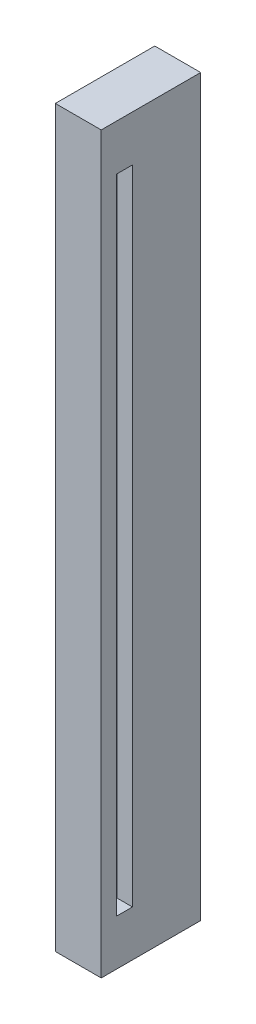
ISO-10303-21;
HEADER;
FILE_DESCRIPTION(('STEP AP214'),'2;1');
FILE_NAME('part.step','',(''),(''),'','','');
FILE_SCHEMA(('AUTOMOTIVE_DESIGN { 1 0 10303 214 1 1 1 1 }'));
ENDSEC;
DATA;
#1=APPLICATION_CONTEXT('core data for automotive mechanical design processes');
#2=APPLICATION_PROTOCOL_DEFINITION('international standard','automotive_design',2000,#1);
#3=PRODUCT_CONTEXT('',#1,'mechanical');
#4=PRODUCT('Part','Part','',(#3));
#5=PRODUCT_RELATED_PRODUCT_CATEGORY('part','',(#4));
#6=PRODUCT_DEFINITION_FORMATION('','',#4);
#7=PRODUCT_DEFINITION_CONTEXT('part definition',#1,'design');
#8=PRODUCT_DEFINITION('design','',#6,#7);
#9=PRODUCT_DEFINITION_SHAPE('','',#8);
#10=(LENGTH_UNIT() NAMED_UNIT(*) SI_UNIT(.MILLI.,.METRE.));
#11=(NAMED_UNIT(*) PLANE_ANGLE_UNIT() SI_UNIT($,.RADIAN.));
#12=(NAMED_UNIT(*) SI_UNIT($,.STERADIAN.) SOLID_ANGLE_UNIT());
#13=UNCERTAINTY_MEASURE_WITH_UNIT(LENGTH_MEASURE(1.E-05),#10,'distance_accuracy_value','');
#14=(GEOMETRIC_REPRESENTATION_CONTEXT(3) GLOBAL_UNCERTAINTY_ASSIGNED_CONTEXT((#13)) GLOBAL_UNIT_ASSIGNED_CONTEXT((#10,
#11,#12)) REPRESENTATION_CONTEXT('',''));
#15=CARTESIAN_POINT('',(0.,0.,0.));
#16=DIRECTION('',(0.,0.,1.));
#17=DIRECTION('',(1.,0.,0.));
#18=AXIS2_PLACEMENT_3D('',#15,#16,#17);
#19=CARTESIAN_POINT('',(9.525,-152.4,41.275));
#20=DIRECTION('',(-1.,0.,0.));
#21=DIRECTION('',(0.,0.,1.));
#22=AXIS2_PLACEMENT_3D('',#19,#20,#21);
#23=PLANE('',#22);
#24=DIRECTION('',(0.,0.,-1.));
#25=VECTOR('',#24,1.);
#26=CARTESIAN_POINT('',(9.525,-133.35,34.925));
#27=LINE('',#26,#25);
#28=CARTESIAN_POINT('',(9.525,-133.35,34.925));
#29=VERTEX_POINT('',#28);
#30=CARTESIAN_POINT('',(9.525,-133.35,28.321));
#31=VERTEX_POINT('',#30);
#32=EDGE_CURVE('E134',#29,#31,#27,.T.);
#33=ORIENTED_EDGE('',*,*,#32,.F.);
#34=DIRECTION('',(0.,-1.,0.));
#35=VECTOR('',#34,1.);
#36=CARTESIAN_POINT('',(9.525,133.35,34.925));
#37=LINE('',#36,#35);
#38=CARTESIAN_POINT('',(9.525,133.35,34.925));
#39=VERTEX_POINT('',#38);
#40=EDGE_CURVE('E46',#39,#29,#37,.T.);
#41=ORIENTED_EDGE('',*,*,#40,.F.);
#42=DIRECTION('',(0.,0.,1.));
#43=VECTOR('',#42,1.);
#44=CARTESIAN_POINT('',(9.525,133.35,34.925));
#45=LINE('',#44,#43);
#46=CARTESIAN_POINT('',(9.525,133.35,28.321));
#47=VERTEX_POINT('',#46);
#48=EDGE_CURVE('E125',#47,#39,#45,.T.);
#49=ORIENTED_EDGE('',*,*,#48,.F.);
#50=DIRECTION('',(0.,1.,0.));
#51=VECTOR('',#50,1.);
#52=CARTESIAN_POINT('',(9.525,133.35,28.321));
#53=LINE('',#52,#51);
#54=EDGE_CURVE('E128',#31,#47,#53,.T.);
#55=ORIENTED_EDGE('',*,*,#54,.F.);
#56=EDGE_LOOP('',(#33,#41,#49,#55));
#57=FACE_BOUND('',#56,.T.);
#58=DIRECTION('',(0.,1.,0.));
#59=VECTOR('',#58,1.);
#60=CARTESIAN_POINT('',(9.525,-152.4,0.));
#61=LINE('',#60,#59);
#62=CARTESIAN_POINT('',(9.525,-152.4,0.));
#63=VERTEX_POINT('',#62);
#64=CARTESIAN_POINT('',(9.525,152.4,0.));
#65=VERTEX_POINT('',#64);
#66=EDGE_CURVE('E140',#63,#65,#61,.T.);
#67=ORIENTED_EDGE('',*,*,#66,.T.);
#68=DIRECTION('',(0.,0.,-1.));
#69=VECTOR('',#68,1.);
#70=CARTESIAN_POINT('',(9.525,152.4,41.275));
#71=LINE('',#70,#69);
#72=CARTESIAN_POINT('',(9.525,152.4,41.275));
#73=VERTEX_POINT('',#72);
#74=EDGE_CURVE('E11',#73,#65,#71,.T.);
#75=ORIENTED_EDGE('',*,*,#74,.F.);
#76=DIRECTION('',(0.,1.,0.));
#77=VECTOR('',#76,1.);
#78=CARTESIAN_POINT('',(9.525,-152.4,41.275));
#79=LINE('',#78,#77);
#80=CARTESIAN_POINT('',(9.525,-152.4,41.275));
#81=VERTEX_POINT('',#80);
#82=EDGE_CURVE('E144',#81,#73,#79,.T.);
#83=ORIENTED_EDGE('',*,*,#82,.F.);
#84=DIRECTION('',(0.,0.,-1.));
#85=VECTOR('',#84,1.);
#86=CARTESIAN_POINT('',(9.525,-152.4,41.275));
#87=LINE('',#86,#85);
#88=EDGE_CURVE('E150',#81,#63,#87,.T.);
#89=ORIENTED_EDGE('',*,*,#88,.T.);
#90=EDGE_LOOP('',(#67,#75,#83,#89));
#91=FACE_BOUND('',#90,.T.);
#92=ADVANCED_FACE('F32',(#57,#91),#23,.F.);
#93=CARTESIAN_POINT('',(-9.525,152.4,41.275));
#94=DIRECTION('',(0.,-1.,0.));
#95=DIRECTION('',(0.,0.,-1.));
#96=AXIS2_PLACEMENT_3D('',#93,#94,#95);
#97=PLANE('',#96);
#98=DIRECTION('',(-1.,0.,0.));
#99=VECTOR('',#98,1.);
#100=CARTESIAN_POINT('',(-9.525,152.4,0.));
#101=LINE('',#100,#99);
#102=CARTESIAN_POINT('',(-9.525,152.4,0.));
#103=VERTEX_POINT('',#102);
#104=EDGE_CURVE('E153',#65,#103,#101,.T.);
#105=ORIENTED_EDGE('',*,*,#104,.T.);
#106=DIRECTION('',(0.,0.,-1.));
#107=VECTOR('',#106,1.);
#108=CARTESIAN_POINT('',(-9.525,152.4,41.275));
#109=LINE('',#108,#107);
#110=CARTESIAN_POINT('',(-9.525,152.4,41.275));
#111=VERTEX_POINT('',#110);
#112=EDGE_CURVE('E39',#111,#103,#109,.T.);
#113=ORIENTED_EDGE('',*,*,#112,.F.);
#114=DIRECTION('',(-1.,0.,0.));
#115=VECTOR('',#114,1.);
#116=CARTESIAN_POINT('',(-9.525,152.4,41.275));
#117=LINE('',#116,#115);
#118=EDGE_CURVE('E83',#73,#111,#117,.T.);
#119=ORIENTED_EDGE('',*,*,#118,.F.);
#120=ORIENTED_EDGE('',*,*,#74,.T.);
#121=EDGE_LOOP('',(#105,#113,#119,#120));
#122=FACE_BOUND('',#121,.T.);
#123=ADVANCED_FACE('F181',(#122),#97,.F.);
#124=CARTESIAN_POINT('',(-9.525,-152.4,41.275));
#125=DIRECTION('',(1.,0.,0.));
#126=DIRECTION('',(0.,0.,-1.));
#127=AXIS2_PLACEMENT_3D('',#124,#125,#126);
#128=PLANE('',#127);
#129=DIRECTION('',(0.,-1.,0.));
#130=VECTOR('',#129,1.);
#131=CARTESIAN_POINT('',(-9.525,-152.4,0.));
#132=LINE('',#131,#130);
#133=CARTESIAN_POINT('',(-9.525,-152.4,0.));
#134=VERTEX_POINT('',#133);
#135=EDGE_CURVE('E155',#103,#134,#132,.T.);
#136=ORIENTED_EDGE('',*,*,#135,.T.);
#137=DIRECTION('',(0.,0.,-1.));
#138=VECTOR('',#137,1.);
#139=CARTESIAN_POINT('',(-9.525,-152.4,41.275));
#140=LINE('',#139,#138);
#141=CARTESIAN_POINT('',(-9.525,-152.4,41.275));
#142=VERTEX_POINT('',#141);
#143=EDGE_CURVE('E159',#142,#134,#140,.T.);
#144=ORIENTED_EDGE('',*,*,#143,.F.);
#145=DIRECTION('',(0.,-1.,0.));
#146=VECTOR('',#145,1.);
#147=CARTESIAN_POINT('',(-9.525,-152.4,41.275));
#148=LINE('',#147,#146);
#149=EDGE_CURVE('E147',#111,#142,#148,.T.);
#150=ORIENTED_EDGE('',*,*,#149,.F.);
#151=ORIENTED_EDGE('',*,*,#112,.T.);
#152=EDGE_LOOP('',(#136,#144,#150,#151));
#153=FACE_BOUND('',#152,.T.);
#154=ADVANCED_FACE('F164',(#153),#128,.F.);
#155=CARTESIAN_POINT('',(-9.525,-152.4,41.275));
#156=DIRECTION('',(0.,1.,0.));
#157=DIRECTION('',(0.,0.,1.));
#158=AXIS2_PLACEMENT_3D('',#155,#156,#157);
#159=PLANE('',#158);
#160=DIRECTION('',(1.,0.,0.));
#161=VECTOR('',#160,1.);
#162=CARTESIAN_POINT('',(-9.525,-152.4,0.));
#163=LINE('',#162,#161);
#164=EDGE_CURVE('E76',#134,#63,#163,.T.);
#165=ORIENTED_EDGE('',*,*,#164,.T.);
#166=ORIENTED_EDGE('',*,*,#88,.F.);
#167=DIRECTION('',(1.,0.,0.));
#168=VECTOR('',#167,1.);
#169=CARTESIAN_POINT('',(-9.525,-152.4,41.275));
#170=LINE('',#169,#168);
#171=EDGE_CURVE('E55',#142,#81,#170,.T.);
#172=ORIENTED_EDGE('',*,*,#171,.F.);
#173=ORIENTED_EDGE('',*,*,#143,.T.);
#174=EDGE_LOOP('',(#165,#166,#172,#173));
#175=FACE_BOUND('',#174,.T.);
#176=ADVANCED_FACE('F172',(#175),#159,.F.);
#177=CARTESIAN_POINT('',(0.,0.,41.275));
#178=DIRECTION('',(0.,0.,-1.));
#179=DIRECTION('',(-1.,0.,0.));
#180=AXIS2_PLACEMENT_3D('',#177,#178,#179);
#181=PLANE('',#180);
#182=ORIENTED_EDGE('',*,*,#82,.T.);
#183=ORIENTED_EDGE('',*,*,#118,.T.);
#184=ORIENTED_EDGE('',*,*,#149,.T.);
#185=ORIENTED_EDGE('',*,*,#171,.T.);
#186=EDGE_LOOP('',(#182,#183,#184,#185));
#187=FACE_BOUND('',#186,.T.);
#188=ADVANCED_FACE('F174',(#187),#181,.F.);
#189=CARTESIAN_POINT('',(0.,0.,0.));
#190=DIRECTION('',(0.,0.,-1.));
#191=DIRECTION('',(-1.,0.,0.));
#192=AXIS2_PLACEMENT_3D('',#189,#190,#191);
#193=PLANE('',#192);
#194=ORIENTED_EDGE('',*,*,#66,.F.);
#195=ORIENTED_EDGE('',*,*,#164,.F.);
#196=ORIENTED_EDGE('',*,*,#135,.F.);
#197=ORIENTED_EDGE('',*,*,#104,.F.);
#198=EDGE_LOOP('',(#194,#195,#196,#197));
#199=FACE_BOUND('',#198,.T.);
#200=ADVANCED_FACE('F168',(#199),#193,.T.);
#201=CARTESIAN_POINT('',(3.175,133.35,34.925));
#202=DIRECTION('',(0.,0.,1.));
#203=DIRECTION('',(1.,0.,0.));
#204=AXIS2_PLACEMENT_3D('',#201,#202,#203);
#205=PLANE('',#204);
#206=ORIENTED_EDGE('',*,*,#40,.T.);
#207=DIRECTION('',(1.,0.,0.));
#208=VECTOR('',#207,1.);
#209=CARTESIAN_POINT('',(3.175,-133.35,34.925));
#210=LINE('',#209,#208);
#211=CARTESIAN_POINT('',(3.175,-133.35,34.925));
#212=VERTEX_POINT('',#211);
#213=EDGE_CURVE('E103',#212,#29,#210,.T.);
#214=ORIENTED_EDGE('',*,*,#213,.F.);
#215=DIRECTION('',(0.,-1.,0.));
#216=VECTOR('',#215,1.);
#217=CARTESIAN_POINT('',(3.175,133.35,34.925));
#218=LINE('',#217,#216);
#219=CARTESIAN_POINT('',(3.175,133.35,34.925));
#220=VERTEX_POINT('',#219);
#221=EDGE_CURVE('E107',#220,#212,#218,.T.);
#222=ORIENTED_EDGE('',*,*,#221,.F.);
#223=DIRECTION('',(1.,0.,0.));
#224=VECTOR('',#223,1.);
#225=CARTESIAN_POINT('',(3.175,133.35,34.925));
#226=LINE('',#225,#224);
#227=EDGE_CURVE('E138',#220,#39,#226,.T.);
#228=ORIENTED_EDGE('',*,*,#227,.T.);
#229=EDGE_LOOP('',(#206,#214,#222,#228));
#230=FACE_BOUND('',#229,.T.);
#231=ADVANCED_FACE('F105',(#230),#205,.F.);
#232=CARTESIAN_POINT('',(3.175,133.35,34.925));
#233=DIRECTION('',(0.,1.,0.));
#234=DIRECTION('',(0.,0.,1.));
#235=AXIS2_PLACEMENT_3D('',#232,#233,#234);
#236=PLANE('',#235);
#237=ORIENTED_EDGE('',*,*,#48,.T.);
#238=ORIENTED_EDGE('',*,*,#227,.F.);
#239=DIRECTION('',(0.,0.,1.));
#240=VECTOR('',#239,1.);
#241=CARTESIAN_POINT('',(3.175,133.35,34.925));
#242=LINE('',#241,#240);
#243=CARTESIAN_POINT('',(3.175,133.35,28.321));
#244=VERTEX_POINT('',#243);
#245=EDGE_CURVE('E113',#244,#220,#242,.T.);
#246=ORIENTED_EDGE('',*,*,#245,.F.);
#247=DIRECTION('',(1.,0.,0.));
#248=VECTOR('',#247,1.);
#249=CARTESIAN_POINT('',(3.175,133.35,28.321));
#250=LINE('',#249,#248);
#251=EDGE_CURVE('E141',#244,#47,#250,.T.);
#252=ORIENTED_EDGE('',*,*,#251,.T.);
#253=EDGE_LOOP('',(#237,#238,#246,#252));
#254=FACE_BOUND('',#253,.T.);
#255=ADVANCED_FACE('F194',(#254),#236,.F.);
#256=CARTESIAN_POINT('',(3.175,133.35,28.321));
#257=DIRECTION('',(0.,0.,-1.));
#258=DIRECTION('',(-1.,0.,0.));
#259=AXIS2_PLACEMENT_3D('',#256,#257,#258);
#260=PLANE('',#259);
#261=ORIENTED_EDGE('',*,*,#54,.T.);
#262=ORIENTED_EDGE('',*,*,#251,.F.);
#263=DIRECTION('',(0.,1.,0.));
#264=VECTOR('',#263,1.);
#265=CARTESIAN_POINT('',(3.175,133.35,28.321));
#266=LINE('',#265,#264);
#267=CARTESIAN_POINT('',(3.175,-133.35,28.321));
#268=VERTEX_POINT('',#267);
#269=EDGE_CURVE('E121',#268,#244,#266,.T.);
#270=ORIENTED_EDGE('',*,*,#269,.F.);
#271=DIRECTION('',(1.,0.,0.));
#272=VECTOR('',#271,1.);
#273=CARTESIAN_POINT('',(3.175,-133.35,28.321));
#274=LINE('',#273,#272);
#275=EDGE_CURVE('E112',#268,#31,#274,.T.);
#276=ORIENTED_EDGE('',*,*,#275,.T.);
#277=EDGE_LOOP('',(#261,#262,#270,#276));
#278=FACE_BOUND('',#277,.T.);
#279=ADVANCED_FACE('F192',(#278),#260,.F.);
#280=CARTESIAN_POINT('',(3.175,-133.35,34.925));
#281=DIRECTION('',(0.,-1.,0.));
#282=DIRECTION('',(0.,0.,-1.));
#283=AXIS2_PLACEMENT_3D('',#280,#281,#282);
#284=PLANE('',#283);
#285=ORIENTED_EDGE('',*,*,#32,.T.);
#286=ORIENTED_EDGE('',*,*,#275,.F.);
#287=DIRECTION('',(0.,0.,-1.));
#288=VECTOR('',#287,1.);
#289=CARTESIAN_POINT('',(3.175,-133.35,34.925));
#290=LINE('',#289,#288);
#291=EDGE_CURVE('E116',#212,#268,#290,.T.);
#292=ORIENTED_EDGE('',*,*,#291,.F.);
#293=ORIENTED_EDGE('',*,*,#213,.T.);
#294=EDGE_LOOP('',(#285,#286,#292,#293));
#295=FACE_BOUND('',#294,.T.);
#296=ADVANCED_FACE('F117',(#295),#284,.F.);
#297=CARTESIAN_POINT('',(3.175,0.,0.));
#298=DIRECTION('',(1.,0.,0.));
#299=DIRECTION('',(0.,0.,-1.));
#300=AXIS2_PLACEMENT_3D('',#297,#298,#299);
#301=PLANE('',#300);
#302=ORIENTED_EDGE('',*,*,#221,.T.);
#303=ORIENTED_EDGE('',*,*,#291,.T.);
#304=ORIENTED_EDGE('',*,*,#269,.T.);
#305=ORIENTED_EDGE('',*,*,#245,.T.);
#306=EDGE_LOOP('',(#302,#303,#304,#305));
#307=FACE_BOUND('',#306,.T.);
#308=ADVANCED_FACE('F123',(#307),#301,.T.);
#309=CLOSED_SHELL('',(#92,#123,#154,#176,#188,#200,#231,#255,#279,#296,#308));
#310=MANIFOLD_SOLID_BREP('B2',#309);
#311=ADVANCED_BREP_SHAPE_REPRESENTATION('',(#18,#310),#14);
#312=SHAPE_DEFINITION_REPRESENTATION(#9,#311);
ENDSEC;
END-ISO-10303-21;
